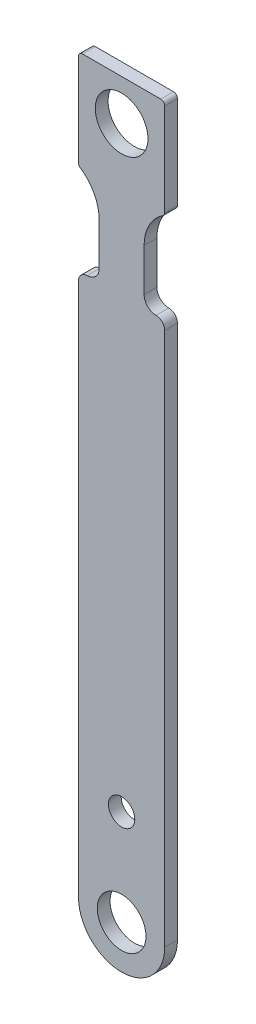
ISO-10303-21;
HEADER;
FILE_DESCRIPTION(('STEP AP214'),'2;1');
FILE_NAME('part.step','',(''),(''),'','','');
FILE_SCHEMA(('AUTOMOTIVE_DESIGN { 1 0 10303 214 1 1 1 1 }'));
ENDSEC;
DATA;
#1=APPLICATION_CONTEXT('core data for automotive mechanical design processes');
#2=APPLICATION_PROTOCOL_DEFINITION('international standard','automotive_design',2000,#1);
#3=PRODUCT_CONTEXT('',#1,'mechanical');
#4=PRODUCT('Part','Part','',(#3));
#5=PRODUCT_RELATED_PRODUCT_CATEGORY('part','',(#4));
#6=PRODUCT_DEFINITION_FORMATION('','',#4);
#7=PRODUCT_DEFINITION_CONTEXT('part definition',#1,'design');
#8=PRODUCT_DEFINITION('design','',#6,#7);
#9=PRODUCT_DEFINITION_SHAPE('','',#8);
#10=(LENGTH_UNIT() NAMED_UNIT(*) SI_UNIT(.MILLI.,.METRE.));
#11=(NAMED_UNIT(*) PLANE_ANGLE_UNIT() SI_UNIT($,.RADIAN.));
#12=(NAMED_UNIT(*) SI_UNIT($,.STERADIAN.) SOLID_ANGLE_UNIT());
#13=UNCERTAINTY_MEASURE_WITH_UNIT(LENGTH_MEASURE(1.E-05),#10,'distance_accuracy_value','');
#14=(GEOMETRIC_REPRESENTATION_CONTEXT(3) GLOBAL_UNCERTAINTY_ASSIGNED_CONTEXT((#13)) GLOBAL_UNIT_ASSIGNED_CONTEXT((#10,
#11,#12)) REPRESENTATION_CONTEXT('',''));
#15=CARTESIAN_POINT('',(0.,0.,0.));
#16=DIRECTION('',(0.,0.,1.));
#17=DIRECTION('',(1.,0.,0.));
#18=AXIS2_PLACEMENT_3D('',#15,#16,#17);
#19=CARTESIAN_POINT('',(-2.14999999999964,33.4670000000008,0.8));
#20=DIRECTION('',(0.,0.,1.));
#21=DIRECTION('',(1.,0.,0.));
#22=AXIS2_PLACEMENT_3D('',#19,#20,#21);
#23=PLANE('',#22);
#24=CARTESIAN_POINT('',(0.,6.,0.8));
#25=DIRECTION('',(0.,0.,1.));
#26=DIRECTION('',(1.,0.,0.));
#27=AXIS2_PLACEMENT_3D('',#24,#25,#26);
#28=CIRCLE('',#27,0.825);
#29=CARTESIAN_POINT('',(0.824999999999999,6.,0.8));
#30=VERTEX_POINT('',#29);
#31=EDGE_CURVE('E364',#30,#30,#28,.T.);
#32=ORIENTED_EDGE('',*,*,#31,.F.);
#33=EDGE_LOOP('',(#32));
#34=FACE_BOUND('',#33,.T.);
#35=CARTESIAN_POINT('',(-2.14999999999964,33.4670000000008,0.8));
#36=DIRECTION('',(0.,0.,1.));
#37=DIRECTION('',(1.,0.,0.));
#38=AXIS2_PLACEMENT_3D('',#35,#36,#37);
#39=CIRCLE('',#38,0.550000000000005);
#40=CARTESIAN_POINT('',(-2.15423076923057,34.0169837275707,0.8));
#41=VERTEX_POINT('',#40);
#42=CARTESIAN_POINT('',(-2.69999999999965,33.4670000000008,0.8));
#43=VERTEX_POINT('',#42);
#44=EDGE_CURVE('E225',#41,#43,#39,.T.);
#45=ORIENTED_EDGE('',*,*,#44,.T.);
#46=DIRECTION('',(0.,-1.,0.));
#47=VECTOR('',#46,1.);
#48=CARTESIAN_POINT('',(-2.69999999999965,33.4670000000008,0.8));
#49=LINE('',#48,#47);
#50=CARTESIAN_POINT('',(-2.69999999999965,0.,0.8));
#51=VERTEX_POINT('',#50);
#52=EDGE_CURVE('E123',#43,#51,#49,.T.);
#53=ORIENTED_EDGE('',*,*,#52,.T.);
#54=CARTESIAN_POINT('',(0.,0.,0.8));
#55=DIRECTION('',(0.,0.,1.));
#56=DIRECTION('',(1.,0.,0.));
#57=AXIS2_PLACEMENT_3D('',#54,#55,#56);
#58=CIRCLE('',#57,2.69999999999965);
#59=CARTESIAN_POINT('',(2.69999999999966,0.,0.8));
#60=VERTEX_POINT('',#59);
#61=EDGE_CURVE('E270',#51,#60,#58,.T.);
#62=ORIENTED_EDGE('',*,*,#61,.T.);
#63=DIRECTION('',(0.,1.,0.));
#64=VECTOR('',#63,1.);
#65=CARTESIAN_POINT('',(2.69999999999966,0.,0.8));
#66=LINE('',#65,#64);
#67=CARTESIAN_POINT('',(2.69999999999966,33.4670000000008,0.8));
#68=VERTEX_POINT('',#67);
#69=EDGE_CURVE('E289',#60,#68,#66,.T.);
#70=ORIENTED_EDGE('',*,*,#69,.T.);
#71=CARTESIAN_POINT('',(2.14999999999964,33.4670000000008,0.8));
#72=DIRECTION('',(0.,0.,1.));
#73=DIRECTION('',(1.,0.,0.));
#74=AXIS2_PLACEMENT_3D('',#71,#72,#73);
#75=CIRCLE('',#74,0.550000000000009);
#76=CARTESIAN_POINT('',(2.15423076923056,34.0169837275707,0.8));
#77=VERTEX_POINT('',#76);
#78=EDGE_CURVE('E286',#68,#77,#75,.T.);
#79=ORIENTED_EDGE('',*,*,#78,.T.);
#80=CARTESIAN_POINT('',(2.16,34.7669615378933,0.8));
#81=DIRECTION('',(0.,0.,-1.));
#82=DIRECTION('',(1.,0.,0.));
#83=AXIS2_PLACEMENT_3D('',#80,#81,#82);
#84=CIRCLE('',#83,0.74999999999999);
#85=CARTESIAN_POINT('',(1.41000000000001,34.7669615378933,0.8));
#86=VERTEX_POINT('',#85);
#87=EDGE_CURVE('E288',#77,#86,#84,.T.);
#88=ORIENTED_EDGE('',*,*,#87,.T.);
#89=DIRECTION('',(0.,1.,0.));
#90=VECTOR('',#89,1.);
#91=CARTESIAN_POINT('',(1.41000000000001,34.7669615378933,0.8));
#92=LINE('',#91,#90);
#93=CARTESIAN_POINT('',(1.41000000000001,37.4420000000768,0.8));
#94=VERTEX_POINT('',#93);
#95=EDGE_CURVE('E291',#86,#94,#92,.T.);
#96=ORIENTED_EDGE('',*,*,#95,.T.);
#97=CARTESIAN_POINT('',(4.06400000015106,37.4420000000768,0.8));
#98=DIRECTION('',(0.,0.,-1.));
#99=DIRECTION('',(1.,0.,0.));
#100=AXIS2_PLACEMENT_3D('',#97,#98,#99);
#101=CIRCLE('',#100,2.65400000015105);
#102=CARTESIAN_POINT('',(2.58894628099719,39.6483391685665,0.8));
#103=VERTEX_POINT('',#102);
#104=EDGE_CURVE('E297',#94,#103,#101,.T.);
#105=ORIENTED_EDGE('',*,*,#104,.T.);
#106=CARTESIAN_POINT('',(2.44999999999965,39.8561706652097,0.8));
#107=DIRECTION('',(0.,0.,1.));
#108=DIRECTION('',(1.,0.,0.));
#109=AXIS2_PLACEMENT_3D('',#106,#107,#108);
#110=CIRCLE('',#109,0.250000000000002);
#111=CARTESIAN_POINT('',(2.69999999999966,39.8561706652097,0.8));
#112=VERTEX_POINT('',#111);
#113=EDGE_CURVE('E299',#103,#112,#110,.T.);
#114=ORIENTED_EDGE('',*,*,#113,.T.);
#115=DIRECTION('',(0.,1.,0.));
#116=VECTOR('',#115,1.);
#117=CARTESIAN_POINT('',(2.69999999999966,39.8561706652097,0.8));
#118=LINE('',#117,#116);
#119=CARTESIAN_POINT('',(2.69999999999966,45.6509999999993,0.8));
#120=VERTEX_POINT('',#119);
#121=EDGE_CURVE('E301',#112,#120,#118,.T.);
#122=ORIENTED_EDGE('',*,*,#121,.T.);
#123=CARTESIAN_POINT('',(2.44999999999965,45.6509999999993,0.8));
#124=DIRECTION('',(0.,0.,1.));
#125=DIRECTION('',(1.,0.,0.));
#126=AXIS2_PLACEMENT_3D('',#123,#124,#125);
#127=CIRCLE('',#126,0.250000000000009);
#128=CARTESIAN_POINT('',(2.44999999999965,45.9009999999993,0.8));
#129=VERTEX_POINT('',#128);
#130=EDGE_CURVE('E303',#120,#129,#127,.T.);
#131=ORIENTED_EDGE('',*,*,#130,.T.);
#132=DIRECTION('',(-1.,0.,0.));
#133=VECTOR('',#132,1.);
#134=CARTESIAN_POINT('',(2.44999999999965,45.9009999999993,0.8));
#135=LINE('',#134,#133);
#136=CARTESIAN_POINT('',(-2.44999999999966,45.9009999999993,0.8));
#137=VERTEX_POINT('',#136);
#138=EDGE_CURVE('E305',#129,#137,#135,.T.);
#139=ORIENTED_EDGE('',*,*,#138,.T.);
#140=CARTESIAN_POINT('',(-2.44999999999966,45.6509999999993,0.8));
#141=DIRECTION('',(0.,0.,1.));
#142=DIRECTION('',(1.,0.,0.));
#143=AXIS2_PLACEMENT_3D('',#140,#141,#142);
#144=CIRCLE('',#143,0.250000000000008);
#145=CARTESIAN_POINT('',(-2.69999999999967,45.6509999999993,0.8));
#146=VERTEX_POINT('',#145);
#147=EDGE_CURVE('E307',#137,#146,#144,.T.);
#148=ORIENTED_EDGE('',*,*,#147,.T.);
#149=DIRECTION('',(0.,-1.,0.));
#150=VECTOR('',#149,1.);
#151=CARTESIAN_POINT('',(-2.69999999999967,45.6509999999993,0.8));
#152=LINE('',#151,#150);
#153=CARTESIAN_POINT('',(-2.69999999999967,39.8561706652097,0.8));
#154=VERTEX_POINT('',#153);
#155=EDGE_CURVE('E309',#146,#154,#152,.T.);
#156=ORIENTED_EDGE('',*,*,#155,.T.);
#157=CARTESIAN_POINT('',(-2.44999999999966,39.8561706652097,0.8));
#158=DIRECTION('',(0.,0.,1.));
#159=DIRECTION('',(1.,0.,0.));
#160=AXIS2_PLACEMENT_3D('',#157,#158,#159);
#161=CIRCLE('',#160,0.250000000000008);
#162=CARTESIAN_POINT('',(-2.58894628099721,39.6483391685665,0.8));
#163=VERTEX_POINT('',#162);
#164=EDGE_CURVE('E172',#154,#163,#161,.T.);
#165=ORIENTED_EDGE('',*,*,#164,.T.);
#166=CARTESIAN_POINT('',(-4.06400000015107,37.4420000000768,0.8));
#167=DIRECTION('',(0.,0.,-1.));
#168=DIRECTION('',(1.,0.,0.));
#169=AXIS2_PLACEMENT_3D('',#166,#167,#168);
#170=CIRCLE('',#169,2.65400000015105);
#171=CARTESIAN_POINT('',(-1.41000000000002,37.4420000000768,0.8));
#172=VERTEX_POINT('',#171);
#173=EDGE_CURVE('E166',#163,#172,#170,.T.);
#174=ORIENTED_EDGE('',*,*,#173,.T.);
#175=DIRECTION('',(0.,-1.,0.));
#176=VECTOR('',#175,1.);
#177=CARTESIAN_POINT('',(-1.41000000000002,37.4420000000768,0.8));
#178=LINE('',#177,#176);
#179=CARTESIAN_POINT('',(-1.41000000000001,34.7669615378933,0.8));
#180=VERTEX_POINT('',#179);
#181=EDGE_CURVE('E170',#172,#180,#178,.T.);
#182=ORIENTED_EDGE('',*,*,#181,.T.);
#183=CARTESIAN_POINT('',(-2.16,34.7669615378933,0.8));
#184=DIRECTION('',(0.,0.,-1.));
#185=DIRECTION('',(1.,0.,0.));
#186=AXIS2_PLACEMENT_3D('',#183,#184,#185);
#187=CIRCLE('',#186,0.749999999999989);
#188=EDGE_CURVE('E50',#180,#41,#187,.T.);
#189=ORIENTED_EDGE('',*,*,#188,.T.);
#190=EDGE_LOOP('',(#45,#53,#62,#70,#79,#88,#96,#105,#114,#122,#131,#139,#148,#156,#165,#174,
#182,#189));
#191=FACE_BOUND('',#190,.T.);
#192=CARTESIAN_POINT('',(0.,0.,0.8));
#193=DIRECTION('',(0.,0.,1.));
#194=DIRECTION('',(1.,0.,0.));
#195=AXIS2_PLACEMENT_3D('',#192,#193,#194);
#196=CIRCLE('',#195,1.525);
#197=CARTESIAN_POINT('',(1.525,0.,0.8));
#198=VERTEX_POINT('',#197);
#199=EDGE_CURVE('E194',#198,#198,#196,.T.);
#200=ORIENTED_EDGE('',*,*,#199,.F.);
#201=EDGE_LOOP('',(#200));
#202=FACE_BOUND('',#201,.T.);
#203=CARTESIAN_POINT('',(0.,43.3509999999993,0.8));
#204=DIRECTION('',(0.,0.,1.));
#205=DIRECTION('',(1.,0.,0.));
#206=AXIS2_PLACEMENT_3D('',#203,#204,#205);
#207=CIRCLE('',#206,1.65);
#208=CARTESIAN_POINT('',(1.65,43.3509999999993,0.8));
#209=VERTEX_POINT('',#208);
#210=EDGE_CURVE('E355',#209,#209,#207,.T.);
#211=ORIENTED_EDGE('',*,*,#210,.F.);
#212=EDGE_LOOP('',(#211));
#213=FACE_BOUND('',#212,.T.);
#214=ADVANCED_FACE('F33',(#34,#191,#202,#213),#23,.T.);
#215=CARTESIAN_POINT('',(-2.14999999999964,33.4670000000008,0.));
#216=DIRECTION('',(0.,0.,1.));
#217=DIRECTION('',(1.,0.,0.));
#218=AXIS2_PLACEMENT_3D('',#215,#216,#217);
#219=PLANE('',#218);
#220=CARTESIAN_POINT('',(-2.14999999999964,33.4670000000008,0.));
#221=DIRECTION('',(0.,0.,1.));
#222=DIRECTION('',(1.,0.,0.));
#223=AXIS2_PLACEMENT_3D('',#220,#221,#222);
#224=CIRCLE('',#223,0.550000000000005);
#225=CARTESIAN_POINT('',(-2.15423076923057,34.0169837275707,0.));
#226=VERTEX_POINT('',#225);
#227=CARTESIAN_POINT('',(-2.69999999999965,33.4670000000008,0.));
#228=VERTEX_POINT('',#227);
#229=EDGE_CURVE('E190',#226,#228,#224,.T.);
#230=ORIENTED_EDGE('',*,*,#229,.F.);
#231=CARTESIAN_POINT('',(-2.16,34.7669615378933,0.));
#232=DIRECTION('',(0.,0.,-1.));
#233=DIRECTION('',(1.,0.,0.));
#234=AXIS2_PLACEMENT_3D('',#231,#232,#233);
#235=CIRCLE('',#234,0.749999999999989);
#236=CARTESIAN_POINT('',(-1.41000000000001,34.7669615378933,0.));
#237=VERTEX_POINT('',#236);
#238=EDGE_CURVE('E115',#237,#226,#235,.T.);
#239=ORIENTED_EDGE('',*,*,#238,.F.);
#240=DIRECTION('',(0.,-1.,0.));
#241=VECTOR('',#240,1.);
#242=CARTESIAN_POINT('',(-1.41000000000002,37.4420000000768,0.));
#243=LINE('',#242,#241);
#244=CARTESIAN_POINT('',(-1.41000000000002,37.4420000000768,0.));
#245=VERTEX_POINT('',#244);
#246=EDGE_CURVE('E109',#245,#237,#243,.T.);
#247=ORIENTED_EDGE('',*,*,#246,.F.);
#248=CARTESIAN_POINT('',(-4.06400000015107,37.4420000000768,0.));
#249=DIRECTION('',(0.,0.,-1.));
#250=DIRECTION('',(1.,0.,0.));
#251=AXIS2_PLACEMENT_3D('',#248,#249,#250);
#252=CIRCLE('',#251,2.65400000015105);
#253=CARTESIAN_POINT('',(-2.58894628099721,39.6483391685665,0.));
#254=VERTEX_POINT('',#253);
#255=EDGE_CURVE('E180',#254,#245,#252,.T.);
#256=ORIENTED_EDGE('',*,*,#255,.F.);
#257=CARTESIAN_POINT('',(-2.44999999999966,39.8561706652097,0.));
#258=DIRECTION('',(0.,0.,1.));
#259=DIRECTION('',(1.,0.,0.));
#260=AXIS2_PLACEMENT_3D('',#257,#258,#259);
#261=CIRCLE('',#260,0.250000000000008);
#262=CARTESIAN_POINT('',(-2.69999999999967,39.8561706652097,0.));
#263=VERTEX_POINT('',#262);
#264=EDGE_CURVE('E220',#263,#254,#261,.T.);
#265=ORIENTED_EDGE('',*,*,#264,.F.);
#266=DIRECTION('',(0.,-1.,0.));
#267=VECTOR('',#266,1.);
#268=CARTESIAN_POINT('',(-2.69999999999967,45.6509999999993,0.));
#269=LINE('',#268,#267);
#270=CARTESIAN_POINT('',(-2.69999999999967,45.6509999999993,0.));
#271=VERTEX_POINT('',#270);
#272=EDGE_CURVE('E218',#271,#263,#269,.T.);
#273=ORIENTED_EDGE('',*,*,#272,.F.);
#274=CARTESIAN_POINT('',(-2.44999999999966,45.6509999999993,0.));
#275=DIRECTION('',(0.,0.,1.));
#276=DIRECTION('',(1.,0.,0.));
#277=AXIS2_PLACEMENT_3D('',#274,#275,#276);
#278=CIRCLE('',#277,0.250000000000008);
#279=CARTESIAN_POINT('',(-2.44999999999966,45.9009999999993,0.));
#280=VERTEX_POINT('',#279);
#281=EDGE_CURVE('E216',#280,#271,#278,.T.);
#282=ORIENTED_EDGE('',*,*,#281,.F.);
#283=DIRECTION('',(-1.,0.,0.));
#284=VECTOR('',#283,1.);
#285=CARTESIAN_POINT('',(2.44999999999965,45.9009999999993,0.));
#286=LINE('',#285,#284);
#287=CARTESIAN_POINT('',(2.44999999999965,45.9009999999993,0.));
#288=VERTEX_POINT('',#287);
#289=EDGE_CURVE('E214',#288,#280,#286,.T.);
#290=ORIENTED_EDGE('',*,*,#289,.F.);
#291=CARTESIAN_POINT('',(2.44999999999965,45.6509999999993,0.));
#292=DIRECTION('',(0.,0.,1.));
#293=DIRECTION('',(1.,0.,0.));
#294=AXIS2_PLACEMENT_3D('',#291,#292,#293);
#295=CIRCLE('',#294,0.250000000000009);
#296=CARTESIAN_POINT('',(2.69999999999966,45.6509999999993,0.));
#297=VERTEX_POINT('',#296);
#298=EDGE_CURVE('E212',#297,#288,#295,.T.);
#299=ORIENTED_EDGE('',*,*,#298,.F.);
#300=DIRECTION('',(0.,1.,0.));
#301=VECTOR('',#300,1.);
#302=CARTESIAN_POINT('',(2.69999999999966,39.8561706652097,0.));
#303=LINE('',#302,#301);
#304=CARTESIAN_POINT('',(2.69999999999966,39.8561706652097,0.));
#305=VERTEX_POINT('',#304);
#306=EDGE_CURVE('E210',#305,#297,#303,.T.);
#307=ORIENTED_EDGE('',*,*,#306,.F.);
#308=CARTESIAN_POINT('',(2.44999999999965,39.8561706652097,0.));
#309=DIRECTION('',(0.,0.,1.));
#310=DIRECTION('',(1.,0.,0.));
#311=AXIS2_PLACEMENT_3D('',#308,#309,#310);
#312=CIRCLE('',#311,0.250000000000002);
#313=CARTESIAN_POINT('',(2.58894628099719,39.6483391685665,0.));
#314=VERTEX_POINT('',#313);
#315=EDGE_CURVE('E208',#314,#305,#312,.T.);
#316=ORIENTED_EDGE('',*,*,#315,.F.);
#317=CARTESIAN_POINT('',(4.06400000015106,37.4420000000768,0.));
#318=DIRECTION('',(0.,0.,-1.));
#319=DIRECTION('',(1.,0.,0.));
#320=AXIS2_PLACEMENT_3D('',#317,#318,#319);
#321=CIRCLE('',#320,2.65400000015105);
#322=CARTESIAN_POINT('',(1.41000000000001,37.4420000000768,0.));
#323=VERTEX_POINT('',#322);
#324=EDGE_CURVE('E206',#323,#314,#321,.T.);
#325=ORIENTED_EDGE('',*,*,#324,.F.);
#326=DIRECTION('',(0.,1.,0.));
#327=VECTOR('',#326,1.);
#328=CARTESIAN_POINT('',(1.41000000000001,34.7669615378933,0.));
#329=LINE('',#328,#327);
#330=CARTESIAN_POINT('',(1.41000000000001,34.7669615378933,0.));
#331=VERTEX_POINT('',#330);
#332=EDGE_CURVE('E204',#331,#323,#329,.T.);
#333=ORIENTED_EDGE('',*,*,#332,.F.);
#334=CARTESIAN_POINT('',(2.16,34.7669615378933,0.));
#335=DIRECTION('',(0.,0.,-1.));
#336=DIRECTION('',(1.,0.,0.));
#337=AXIS2_PLACEMENT_3D('',#334,#335,#336);
#338=CIRCLE('',#337,0.74999999999999);
#339=CARTESIAN_POINT('',(2.15423076923056,34.0169837275707,0.));
#340=VERTEX_POINT('',#339);
#341=EDGE_CURVE('E202',#340,#331,#338,.T.);
#342=ORIENTED_EDGE('',*,*,#341,.F.);
#343=CARTESIAN_POINT('',(2.14999999999964,33.4670000000008,0.));
#344=DIRECTION('',(0.,0.,1.));
#345=DIRECTION('',(1.,0.,0.));
#346=AXIS2_PLACEMENT_3D('',#343,#344,#345);
#347=CIRCLE('',#346,0.550000000000009);
#348=CARTESIAN_POINT('',(2.69999999999966,33.4670000000008,0.));
#349=VERTEX_POINT('',#348);
#350=EDGE_CURVE('E200',#349,#340,#347,.T.);
#351=ORIENTED_EDGE('',*,*,#350,.F.);
#352=DIRECTION('',(0.,1.,0.));
#353=VECTOR('',#352,1.);
#354=CARTESIAN_POINT('',(2.69999999999966,0.,0.));
#355=LINE('',#354,#353);
#356=CARTESIAN_POINT('',(2.69999999999966,0.,0.));
#357=VERTEX_POINT('',#356);
#358=EDGE_CURVE('E198',#357,#349,#355,.T.);
#359=ORIENTED_EDGE('',*,*,#358,.F.);
#360=CARTESIAN_POINT('',(0.,0.,0.));
#361=DIRECTION('',(0.,0.,1.));
#362=DIRECTION('',(1.,0.,0.));
#363=AXIS2_PLACEMENT_3D('',#360,#361,#362);
#364=CIRCLE('',#363,2.69999999999965);
#365=CARTESIAN_POINT('',(-2.69999999999965,0.,0.));
#366=VERTEX_POINT('',#365);
#367=EDGE_CURVE('E196',#366,#357,#364,.T.);
#368=ORIENTED_EDGE('',*,*,#367,.F.);
#369=DIRECTION('',(0.,-1.,0.));
#370=VECTOR('',#369,1.);
#371=CARTESIAN_POINT('',(-2.69999999999965,33.4670000000008,0.));
#372=LINE('',#371,#370);
#373=EDGE_CURVE('E193',#228,#366,#372,.T.);
#374=ORIENTED_EDGE('',*,*,#373,.F.);
#375=EDGE_LOOP('',(#230,#239,#247,#256,#265,#273,#282,#290,#299,#307,#316,#325,#333,#342,#351,
#359,#368,#374));
#376=FACE_BOUND('',#375,.T.);
#377=CARTESIAN_POINT('',(0.,0.,0.));
#378=DIRECTION('',(0.,0.,1.));
#379=DIRECTION('',(1.,0.,0.));
#380=AXIS2_PLACEMENT_3D('',#377,#378,#379);
#381=CIRCLE('',#380,1.525);
#382=CARTESIAN_POINT('',(1.525,0.,0.));
#383=VERTEX_POINT('',#382);
#384=EDGE_CURVE('E367',#383,#383,#381,.T.);
#385=ORIENTED_EDGE('',*,*,#384,.T.);
#386=EDGE_LOOP('',(#385));
#387=FACE_BOUND('',#386,.T.);
#388=CARTESIAN_POINT('',(0.,6.,0.));
#389=DIRECTION('',(0.,0.,1.));
#390=DIRECTION('',(1.,0.,0.));
#391=AXIS2_PLACEMENT_3D('',#388,#389,#390);
#392=CIRCLE('',#391,0.825);
#393=CARTESIAN_POINT('',(0.824999999999999,6.,0.));
#394=VERTEX_POINT('',#393);
#395=EDGE_CURVE('E361',#394,#394,#392,.T.);
#396=ORIENTED_EDGE('',*,*,#395,.T.);
#397=EDGE_LOOP('',(#396));
#398=FACE_BOUND('',#397,.T.);
#399=CARTESIAN_POINT('',(0.,43.3509999999993,0.));
#400=DIRECTION('',(0.,0.,1.));
#401=DIRECTION('',(1.,0.,0.));
#402=AXIS2_PLACEMENT_3D('',#399,#400,#401);
#403=CIRCLE('',#402,1.65);
#404=CARTESIAN_POINT('',(1.65,43.3509999999993,0.));
#405=VERTEX_POINT('',#404);
#406=EDGE_CURVE('E358',#405,#405,#403,.T.);
#407=ORIENTED_EDGE('',*,*,#406,.T.);
#408=EDGE_LOOP('',(#407));
#409=FACE_BOUND('',#408,.T.);
#410=ADVANCED_FACE('F274',(#376,#387,#398,#409),#219,.F.);
#411=CARTESIAN_POINT('',(-2.14999999999964,33.4670000000008,0.8));
#412=DIRECTION('',(0.,0.,-1.));
#413=DIRECTION('',(-1.,0.,0.));
#414=AXIS2_PLACEMENT_3D('',#411,#412,#413);
#415=CYLINDRICAL_SURFACE('',#414,0.550000000000005);
#416=ORIENTED_EDGE('',*,*,#229,.T.);
#417=DIRECTION('',(0.,0.,-1.));
#418=VECTOR('',#417,1.);
#419=CARTESIAN_POINT('',(-2.69999999999965,33.4670000000008,0.8));
#420=LINE('',#419,#418);
#421=EDGE_CURVE('E11',#43,#228,#420,.T.);
#422=ORIENTED_EDGE('',*,*,#421,.F.);
#423=ORIENTED_EDGE('',*,*,#44,.F.);
#424=DIRECTION('',(0.,0.,-1.));
#425=VECTOR('',#424,1.);
#426=CARTESIAN_POINT('',(-2.15423076923057,34.0169837275707,0.8));
#427=LINE('',#426,#425);
#428=EDGE_CURVE('E186',#41,#226,#427,.T.);
#429=ORIENTED_EDGE('',*,*,#428,.T.);
#430=EDGE_LOOP('',(#416,#422,#423,#429));
#431=FACE_BOUND('',#430,.T.);
#432=ADVANCED_FACE('F35',(#431),#415,.T.);
#433=CARTESIAN_POINT('',(-2.69999999999965,33.4670000000008,0.8));
#434=DIRECTION('',(1.,0.,0.));
#435=DIRECTION('',(0.,0.,-1.));
#436=AXIS2_PLACEMENT_3D('',#433,#434,#435);
#437=PLANE('',#436);
#438=ORIENTED_EDGE('',*,*,#373,.T.);
#439=DIRECTION('',(0.,0.,-1.));
#440=VECTOR('',#439,1.);
#441=CARTESIAN_POINT('',(-2.69999999999965,0.,0.8));
#442=LINE('',#441,#440);
#443=EDGE_CURVE('E42',#51,#366,#442,.T.);
#444=ORIENTED_EDGE('',*,*,#443,.F.);
#445=ORIENTED_EDGE('',*,*,#52,.F.);
#446=ORIENTED_EDGE('',*,*,#421,.T.);
#447=EDGE_LOOP('',(#438,#444,#445,#446));
#448=FACE_BOUND('',#447,.T.);
#449=ADVANCED_FACE('F529',(#448),#437,.F.);
#450=CARTESIAN_POINT('',(0.,0.,0.8));
#451=DIRECTION('',(0.,0.,-1.));
#452=DIRECTION('',(-1.,0.,0.));
#453=AXIS2_PLACEMENT_3D('',#450,#451,#452);
#454=CYLINDRICAL_SURFACE('',#453,2.69999999999965);
#455=ORIENTED_EDGE('',*,*,#367,.T.);
#456=DIRECTION('',(0.,0.,-1.));
#457=VECTOR('',#456,1.);
#458=CARTESIAN_POINT('',(2.69999999999966,0.,0.8));
#459=LINE('',#458,#457);
#460=EDGE_CURVE('E262',#60,#357,#459,.T.);
#461=ORIENTED_EDGE('',*,*,#460,.F.);
#462=ORIENTED_EDGE('',*,*,#61,.F.);
#463=ORIENTED_EDGE('',*,*,#443,.T.);
#464=EDGE_LOOP('',(#455,#461,#462,#463));
#465=FACE_BOUND('',#464,.T.);
#466=ADVANCED_FACE('F268',(#465),#454,.T.);
#467=CARTESIAN_POINT('',(2.69999999999966,0.,0.8));
#468=DIRECTION('',(-1.,0.,0.));
#469=DIRECTION('',(0.,0.,1.));
#470=AXIS2_PLACEMENT_3D('',#467,#468,#469);
#471=PLANE('',#470);
#472=ORIENTED_EDGE('',*,*,#358,.T.);
#473=DIRECTION('',(0.,0.,-1.));
#474=VECTOR('',#473,1.);
#475=CARTESIAN_POINT('',(2.69999999999966,33.4670000000008,0.8));
#476=LINE('',#475,#474);
#477=EDGE_CURVE('E259',#68,#349,#476,.T.);
#478=ORIENTED_EDGE('',*,*,#477,.F.);
#479=ORIENTED_EDGE('',*,*,#69,.F.);
#480=ORIENTED_EDGE('',*,*,#460,.T.);
#481=EDGE_LOOP('',(#472,#478,#479,#480));
#482=FACE_BOUND('',#481,.T.);
#483=ADVANCED_FACE('F280',(#482),#471,.F.);
#484=CARTESIAN_POINT('',(2.14999999999964,33.4670000000008,0.8));
#485=DIRECTION('',(0.,0.,-1.));
#486=DIRECTION('',(-1.,0.,0.));
#487=AXIS2_PLACEMENT_3D('',#484,#485,#486);
#488=CYLINDRICAL_SURFACE('',#487,0.550000000000009);
#489=ORIENTED_EDGE('',*,*,#350,.T.);
#490=DIRECTION('',(0.,0.,-1.));
#491=VECTOR('',#490,1.);
#492=CARTESIAN_POINT('',(2.15423076923056,34.0169837275707,0.8));
#493=LINE('',#492,#491);
#494=EDGE_CURVE('E256',#77,#340,#493,.T.);
#495=ORIENTED_EDGE('',*,*,#494,.F.);
#496=ORIENTED_EDGE('',*,*,#78,.F.);
#497=ORIENTED_EDGE('',*,*,#477,.T.);
#498=EDGE_LOOP('',(#489,#495,#496,#497));
#499=FACE_BOUND('',#498,.T.);
#500=ADVANCED_FACE('F284',(#499),#488,.T.);
#501=CARTESIAN_POINT('',(2.16,34.7669615378933,0.8));
#502=DIRECTION('',(0.,0.,-1.));
#503=DIRECTION('',(-1.,0.,0.));
#504=AXIS2_PLACEMENT_3D('',#501,#502,#503);
#505=CYLINDRICAL_SURFACE('',#504,0.74999999999999);
#506=ORIENTED_EDGE('',*,*,#341,.T.);
#507=DIRECTION('',(0.,0.,-1.));
#508=VECTOR('',#507,1.);
#509=CARTESIAN_POINT('',(1.41000000000001,34.7669615378933,0.8));
#510=LINE('',#509,#508);
#511=EDGE_CURVE('E253',#86,#331,#510,.T.);
#512=ORIENTED_EDGE('',*,*,#511,.F.);
#513=ORIENTED_EDGE('',*,*,#87,.F.);
#514=ORIENTED_EDGE('',*,*,#494,.T.);
#515=EDGE_LOOP('',(#506,#512,#513,#514));
#516=FACE_BOUND('',#515,.T.);
#517=ADVANCED_FACE('F494',(#516),#505,.F.);
#518=CARTESIAN_POINT('',(1.41000000000001,34.7669615378933,0.8));
#519=DIRECTION('',(-1.,0.,0.));
#520=DIRECTION('',(0.,-1.,0.));
#521=AXIS2_PLACEMENT_3D('',#518,#519,#520);
#522=PLANE('',#521);
#523=ORIENTED_EDGE('',*,*,#332,.T.);
#524=DIRECTION('',(0.,0.,-1.));
#525=VECTOR('',#524,1.);
#526=CARTESIAN_POINT('',(1.41000000000001,37.4420000000768,0.8));
#527=LINE('',#526,#525);
#528=EDGE_CURVE('E250',#94,#323,#527,.T.);
#529=ORIENTED_EDGE('',*,*,#528,.F.);
#530=ORIENTED_EDGE('',*,*,#95,.F.);
#531=ORIENTED_EDGE('',*,*,#511,.T.);
#532=EDGE_LOOP('',(#523,#529,#530,#531));
#533=FACE_BOUND('',#532,.T.);
#534=ADVANCED_FACE('F484',(#533),#522,.F.);
#535=CARTESIAN_POINT('',(4.06400000015106,37.4420000000768,0.8));
#536=DIRECTION('',(0.,0.,-1.));
#537=DIRECTION('',(-1.,0.,0.));
#538=AXIS2_PLACEMENT_3D('',#535,#536,#537);
#539=CYLINDRICAL_SURFACE('',#538,2.65400000015105);
#540=ORIENTED_EDGE('',*,*,#324,.T.);
#541=DIRECTION('',(0.,0.,-1.));
#542=VECTOR('',#541,1.);
#543=CARTESIAN_POINT('',(2.58894628099719,39.6483391685665,0.8));
#544=LINE('',#543,#542);
#545=EDGE_CURVE('E247',#103,#314,#544,.T.);
#546=ORIENTED_EDGE('',*,*,#545,.F.);
#547=ORIENTED_EDGE('',*,*,#104,.F.);
#548=ORIENTED_EDGE('',*,*,#528,.T.);
#549=EDGE_LOOP('',(#540,#546,#547,#548));
#550=FACE_BOUND('',#549,.T.);
#551=ADVANCED_FACE('F474',(#550),#539,.F.);
#552=CARTESIAN_POINT('',(2.44999999999965,39.8561706652097,0.8));
#553=DIRECTION('',(0.,0.,-1.));
#554=DIRECTION('',(-1.,0.,0.));
#555=AXIS2_PLACEMENT_3D('',#552,#553,#554);
#556=CYLINDRICAL_SURFACE('',#555,0.250000000000002);
#557=ORIENTED_EDGE('',*,*,#315,.T.);
#558=DIRECTION('',(0.,0.,-1.));
#559=VECTOR('',#558,1.);
#560=CARTESIAN_POINT('',(2.69999999999966,39.8561706652097,0.8));
#561=LINE('',#560,#559);
#562=EDGE_CURVE('E244',#112,#305,#561,.T.);
#563=ORIENTED_EDGE('',*,*,#562,.F.);
#564=ORIENTED_EDGE('',*,*,#113,.F.);
#565=ORIENTED_EDGE('',*,*,#545,.T.);
#566=EDGE_LOOP('',(#557,#563,#564,#565));
#567=FACE_BOUND('',#566,.T.);
#568=ADVANCED_FACE('F464',(#567),#556,.T.);
#569=CARTESIAN_POINT('',(2.69999999999966,39.8561706652097,0.8));
#570=DIRECTION('',(-1.,0.,0.));
#571=DIRECTION('',(0.,-1.,0.));
#572=AXIS2_PLACEMENT_3D('',#569,#570,#571);
#573=PLANE('',#572);
#574=ORIENTED_EDGE('',*,*,#306,.T.);
#575=DIRECTION('',(0.,0.,-1.));
#576=VECTOR('',#575,1.);
#577=CARTESIAN_POINT('',(2.69999999999966,45.6509999999993,0.8));
#578=LINE('',#577,#576);
#579=EDGE_CURVE('E241',#120,#297,#578,.T.);
#580=ORIENTED_EDGE('',*,*,#579,.F.);
#581=ORIENTED_EDGE('',*,*,#121,.F.);
#582=ORIENTED_EDGE('',*,*,#562,.T.);
#583=EDGE_LOOP('',(#574,#580,#581,#582));
#584=FACE_BOUND('',#583,.T.);
#585=ADVANCED_FACE('F454',(#584),#573,.F.);
#586=CARTESIAN_POINT('',(2.44999999999965,45.6509999999993,0.8));
#587=DIRECTION('',(0.,0.,-1.));
#588=DIRECTION('',(-1.,0.,0.));
#589=AXIS2_PLACEMENT_3D('',#586,#587,#588);
#590=CYLINDRICAL_SURFACE('',#589,0.250000000000009);
#591=ORIENTED_EDGE('',*,*,#298,.T.);
#592=DIRECTION('',(0.,0.,-1.));
#593=VECTOR('',#592,1.);
#594=CARTESIAN_POINT('',(2.44999999999965,45.9009999999993,0.8));
#595=LINE('',#594,#593);
#596=EDGE_CURVE('E238',#129,#288,#595,.T.);
#597=ORIENTED_EDGE('',*,*,#596,.F.);
#598=ORIENTED_EDGE('',*,*,#130,.F.);
#599=ORIENTED_EDGE('',*,*,#579,.T.);
#600=EDGE_LOOP('',(#591,#597,#598,#599));
#601=FACE_BOUND('',#600,.T.);
#602=ADVANCED_FACE('F444',(#601),#590,.T.);
#603=CARTESIAN_POINT('',(2.44999999999965,45.9009999999993,0.8));
#604=DIRECTION('',(0.,-1.,0.));
#605=DIRECTION('',(0.,0.,-1.));
#606=AXIS2_PLACEMENT_3D('',#603,#604,#605);
#607=PLANE('',#606);
#608=ORIENTED_EDGE('',*,*,#289,.T.);
#609=DIRECTION('',(0.,0.,-1.));
#610=VECTOR('',#609,1.);
#611=CARTESIAN_POINT('',(-2.44999999999966,45.9009999999993,0.8));
#612=LINE('',#611,#610);
#613=EDGE_CURVE('E235',#137,#280,#612,.T.);
#614=ORIENTED_EDGE('',*,*,#613,.F.);
#615=ORIENTED_EDGE('',*,*,#138,.F.);
#616=ORIENTED_EDGE('',*,*,#596,.T.);
#617=EDGE_LOOP('',(#608,#614,#615,#616));
#618=FACE_BOUND('',#617,.T.);
#619=ADVANCED_FACE('F434',(#618),#607,.F.);
#620=CARTESIAN_POINT('',(-2.44999999999966,45.6509999999993,0.8));
#621=DIRECTION('',(0.,0.,-1.));
#622=DIRECTION('',(-1.,0.,0.));
#623=AXIS2_PLACEMENT_3D('',#620,#621,#622);
#624=CYLINDRICAL_SURFACE('',#623,0.250000000000008);
#625=ORIENTED_EDGE('',*,*,#281,.T.);
#626=DIRECTION('',(0.,0.,-1.));
#627=VECTOR('',#626,1.);
#628=CARTESIAN_POINT('',(-2.69999999999967,45.6509999999993,0.8));
#629=LINE('',#628,#627);
#630=EDGE_CURVE('E232',#146,#271,#629,.T.);
#631=ORIENTED_EDGE('',*,*,#630,.F.);
#632=ORIENTED_EDGE('',*,*,#147,.F.);
#633=ORIENTED_EDGE('',*,*,#613,.T.);
#634=EDGE_LOOP('',(#625,#631,#632,#633));
#635=FACE_BOUND('',#634,.T.);
#636=ADVANCED_FACE('F425',(#635),#624,.T.);
#637=CARTESIAN_POINT('',(-2.69999999999967,45.6509999999993,0.8));
#638=DIRECTION('',(1.,0.,0.));
#639=DIRECTION('',(0.,0.,-1.));
#640=AXIS2_PLACEMENT_3D('',#637,#638,#639);
#641=PLANE('',#640);
#642=ORIENTED_EDGE('',*,*,#272,.T.);
#643=DIRECTION('',(0.,0.,-1.));
#644=VECTOR('',#643,1.);
#645=CARTESIAN_POINT('',(-2.69999999999967,39.8561706652097,0.8));
#646=LINE('',#645,#644);
#647=EDGE_CURVE('E229',#154,#263,#646,.T.);
#648=ORIENTED_EDGE('',*,*,#647,.F.);
#649=ORIENTED_EDGE('',*,*,#155,.F.);
#650=ORIENTED_EDGE('',*,*,#630,.T.);
#651=EDGE_LOOP('',(#642,#648,#649,#650));
#652=FACE_BOUND('',#651,.T.);
#653=ADVANCED_FACE('F315',(#652),#641,.F.);
#654=CARTESIAN_POINT('',(-2.44999999999966,39.8561706652097,0.8));
#655=DIRECTION('',(0.,0.,-1.));
#656=DIRECTION('',(-1.,0.,0.));
#657=AXIS2_PLACEMENT_3D('',#654,#655,#656);
#658=CYLINDRICAL_SURFACE('',#657,0.250000000000008);
#659=ORIENTED_EDGE('',*,*,#264,.T.);
#660=DIRECTION('',(0.,0.,-1.));
#661=VECTOR('',#660,1.);
#662=CARTESIAN_POINT('',(-2.58894628099721,39.6483391685665,0.8));
#663=LINE('',#662,#661);
#664=EDGE_CURVE('E181',#163,#254,#663,.T.);
#665=ORIENTED_EDGE('',*,*,#664,.F.);
#666=ORIENTED_EDGE('',*,*,#164,.F.);
#667=ORIENTED_EDGE('',*,*,#647,.T.);
#668=EDGE_LOOP('',(#659,#665,#666,#667));
#669=FACE_BOUND('',#668,.T.);
#670=ADVANCED_FACE('F319',(#669),#658,.T.);
#671=CARTESIAN_POINT('',(-4.06400000015107,37.4420000000768,0.8));
#672=DIRECTION('',(0.,0.,-1.));
#673=DIRECTION('',(-1.,0.,0.));
#674=AXIS2_PLACEMENT_3D('',#671,#672,#673);
#675=CYLINDRICAL_SURFACE('',#674,2.65400000015105);
#676=ORIENTED_EDGE('',*,*,#255,.T.);
#677=DIRECTION('',(0.,0.,-1.));
#678=VECTOR('',#677,1.);
#679=CARTESIAN_POINT('',(-1.41000000000002,37.4420000000768,0.8));
#680=LINE('',#679,#678);
#681=EDGE_CURVE('E177',#172,#245,#680,.T.);
#682=ORIENTED_EDGE('',*,*,#681,.F.);
#683=ORIENTED_EDGE('',*,*,#173,.F.);
#684=ORIENTED_EDGE('',*,*,#664,.T.);
#685=EDGE_LOOP('',(#676,#682,#683,#684));
#686=FACE_BOUND('',#685,.T.);
#687=ADVANCED_FACE('F178',(#686),#675,.F.);
#688=CARTESIAN_POINT('',(-1.41000000000002,37.4420000000768,0.8));
#689=DIRECTION('',(1.,0.,0.));
#690=DIRECTION('',(0.,1.,0.));
#691=AXIS2_PLACEMENT_3D('',#688,#689,#690);
#692=PLANE('',#691);
#693=ORIENTED_EDGE('',*,*,#246,.T.);
#694=DIRECTION('',(0.,0.,-1.));
#695=VECTOR('',#694,1.);
#696=CARTESIAN_POINT('',(-1.41000000000001,34.7669615378933,0.8));
#697=LINE('',#696,#695);
#698=EDGE_CURVE('E182',#180,#237,#697,.T.);
#699=ORIENTED_EDGE('',*,*,#698,.F.);
#700=ORIENTED_EDGE('',*,*,#181,.F.);
#701=ORIENTED_EDGE('',*,*,#681,.T.);
#702=EDGE_LOOP('',(#693,#699,#700,#701));
#703=FACE_BOUND('',#702,.T.);
#704=ADVANCED_FACE('F184',(#703),#692,.F.);
#705=CARTESIAN_POINT('',(-2.16,34.7669615378933,0.8));
#706=DIRECTION('',(0.,0.,-1.));
#707=DIRECTION('',(-1.,0.,0.));
#708=AXIS2_PLACEMENT_3D('',#705,#706,#707);
#709=CYLINDRICAL_SURFACE('',#708,0.749999999999989);
#710=ORIENTED_EDGE('',*,*,#238,.T.);
#711=ORIENTED_EDGE('',*,*,#428,.F.);
#712=ORIENTED_EDGE('',*,*,#188,.F.);
#713=ORIENTED_EDGE('',*,*,#698,.T.);
#714=EDGE_LOOP('',(#710,#711,#712,#713));
#715=FACE_BOUND('',#714,.T.);
#716=ADVANCED_FACE('F323',(#715),#709,.F.);
#717=CARTESIAN_POINT('',(0.,0.,0.8));
#718=DIRECTION('',(0.,0.,-1.));
#719=DIRECTION('',(-1.,0.,0.));
#720=AXIS2_PLACEMENT_3D('',#717,#718,#719);
#721=CYLINDRICAL_SURFACE('',#720,1.525);
#722=ORIENTED_EDGE('',*,*,#199,.T.);
#723=EDGE_LOOP('',(#722));
#724=FACE_BOUND('',#723,.T.);
#725=ORIENTED_EDGE('',*,*,#384,.F.);
#726=EDGE_LOOP('',(#725));
#727=FACE_BOUND('',#726,.T.);
#728=ADVANCED_FACE('F325',(#724,#727),#721,.F.);
#729=CARTESIAN_POINT('',(0.,6.,0.8));
#730=DIRECTION('',(0.,0.,-1.));
#731=DIRECTION('',(-1.,0.,0.));
#732=AXIS2_PLACEMENT_3D('',#729,#730,#731);
#733=CYLINDRICAL_SURFACE('',#732,0.825);
#734=ORIENTED_EDGE('',*,*,#31,.T.);
#735=EDGE_LOOP('',(#734));
#736=FACE_BOUND('',#735,.T.);
#737=ORIENTED_EDGE('',*,*,#395,.F.);
#738=EDGE_LOOP('',(#737));
#739=FACE_BOUND('',#738,.T.);
#740=ADVANCED_FACE('F331',(#736,#739),#733,.F.);
#741=CARTESIAN_POINT('',(0.,43.3509999999993,0.8));
#742=DIRECTION('',(0.,0.,-1.));
#743=DIRECTION('',(-1.,0.,0.));
#744=AXIS2_PLACEMENT_3D('',#741,#742,#743);
#745=CYLINDRICAL_SURFACE('',#744,1.65);
#746=ORIENTED_EDGE('',*,*,#210,.T.);
#747=EDGE_LOOP('',(#746));
#748=FACE_BOUND('',#747,.T.);
#749=ORIENTED_EDGE('',*,*,#406,.F.);
#750=EDGE_LOOP('',(#749));
#751=FACE_BOUND('',#750,.T.);
#752=ADVANCED_FACE('F346',(#748,#751),#745,.F.);
#753=CLOSED_SHELL('',(#214,#410,#432,#449,#466,#483,#500,#517,#534,#551,#568,#585,#602,#619,
#636,#653,#670,#687,#704,#716,#728,#740,#752));
#754=MANIFOLD_SOLID_BREP('B2',#753);
#755=ADVANCED_BREP_SHAPE_REPRESENTATION('',(#18,#754),#14);
#756=SHAPE_DEFINITION_REPRESENTATION(#9,#755);
ENDSEC;
END-ISO-10303-21;
